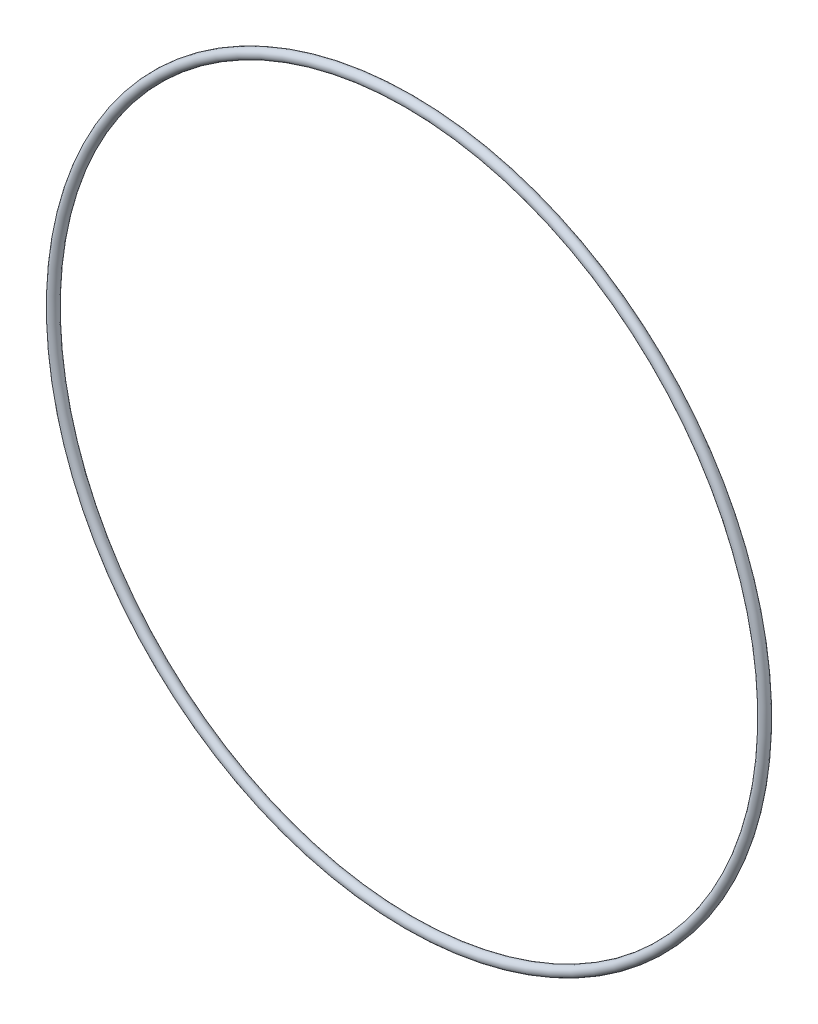
ISO-10303-21;
HEADER;
FILE_DESCRIPTION(('STEP AP214'),'2;1');
FILE_NAME('part.step','',(''),(''),'','','');
FILE_SCHEMA(('AUTOMOTIVE_DESIGN { 1 0 10303 214 1 1 1 1 }'));
ENDSEC;
DATA;
#1=APPLICATION_CONTEXT('core data for automotive mechanical design processes');
#2=APPLICATION_PROTOCOL_DEFINITION('international standard','automotive_design',2000,#1);
#3=PRODUCT_CONTEXT('',#1,'mechanical');
#4=PRODUCT('Part','Part','',(#3));
#5=PRODUCT_RELATED_PRODUCT_CATEGORY('part','',(#4));
#6=PRODUCT_DEFINITION_FORMATION('','',#4);
#7=PRODUCT_DEFINITION_CONTEXT('part definition',#1,'design');
#8=PRODUCT_DEFINITION('design','',#6,#7);
#9=PRODUCT_DEFINITION_SHAPE('','',#8);
#10=(LENGTH_UNIT() NAMED_UNIT(*) SI_UNIT(.MILLI.,.METRE.));
#11=(NAMED_UNIT(*) PLANE_ANGLE_UNIT() SI_UNIT($,.RADIAN.));
#12=(NAMED_UNIT(*) SI_UNIT($,.STERADIAN.) SOLID_ANGLE_UNIT());
#13=UNCERTAINTY_MEASURE_WITH_UNIT(LENGTH_MEASURE(1.E-05),#10,'distance_accuracy_value','');
#14=(GEOMETRIC_REPRESENTATION_CONTEXT(3) GLOBAL_UNCERTAINTY_ASSIGNED_CONTEXT((#13)) GLOBAL_UNIT_ASSIGNED_CONTEXT((#10,
#11,#12)) REPRESENTATION_CONTEXT('',''));
#15=CARTESIAN_POINT('',(0.,0.,0.));
#16=DIRECTION('',(0.,0.,1.));
#17=DIRECTION('',(1.,0.,0.));
#18=AXIS2_PLACEMENT_3D('',#15,#16,#17);
#19=CARTESIAN_POINT('',(0.,0.,0.));
#20=DIRECTION('',(0.,0.,1.));
#21=DIRECTION('',(0.,-1.,0.));
#22=AXIS2_PLACEMENT_3D('',#19,#20,#21);
#23=TOROIDAL_SURFACE('',#22,64.2493,0.888999999999999);
#24=CARTESIAN_POINT('',(0.,-65.1383,0.));
#25=VERTEX_POINT('',#24);
#26=VERTEX_LOOP('',#25);
#27=FACE_BOUND('',#26,.T.);
#28=ADVANCED_FACE('F35',(#27),#23,.T.);
#29=CLOSED_SHELL('',(#28));
#30=MANIFOLD_SOLID_BREP('B2',#29);
#31=ADVANCED_BREP_SHAPE_REPRESENTATION('',(#18,#30),#14);
#32=SHAPE_DEFINITION_REPRESENTATION(#9,#31);
ENDSEC;
END-ISO-10303-21;
